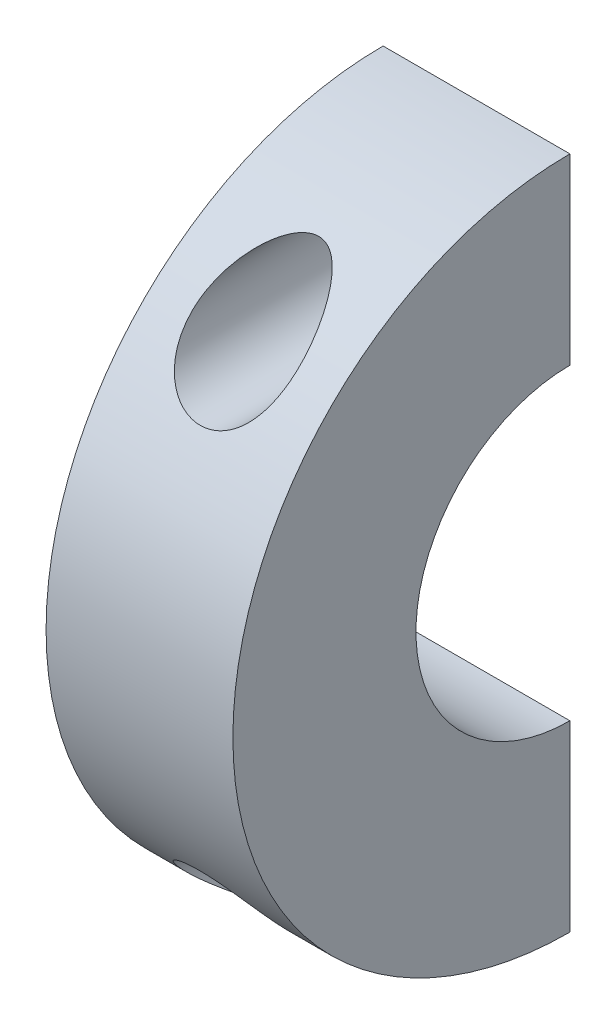
ISO-10303-21;
HEADER;
FILE_DESCRIPTION(('STEP AP214'),'2;1');
FILE_NAME('part.step','',(''),(''),'','','');
FILE_SCHEMA(('AUTOMOTIVE_DESIGN { 1 0 10303 214 1 1 1 1 }'));
ENDSEC;
DATA;
#1=APPLICATION_CONTEXT('core data for automotive mechanical design processes');
#2=APPLICATION_PROTOCOL_DEFINITION('international standard','automotive_design',2000,#1);
#3=PRODUCT_CONTEXT('',#1,'mechanical');
#4=PRODUCT('Part','Part','',(#3));
#5=PRODUCT_RELATED_PRODUCT_CATEGORY('part','',(#4));
#6=PRODUCT_DEFINITION_FORMATION('','',#4);
#7=PRODUCT_DEFINITION_CONTEXT('part definition',#1,'design');
#8=PRODUCT_DEFINITION('design','',#6,#7);
#9=PRODUCT_DEFINITION_SHAPE('','',#8);
#10=(LENGTH_UNIT() NAMED_UNIT(*) SI_UNIT(.MILLI.,.METRE.));
#11=(NAMED_UNIT(*) PLANE_ANGLE_UNIT() SI_UNIT($,.RADIAN.));
#12=(NAMED_UNIT(*) SI_UNIT($,.STERADIAN.) SOLID_ANGLE_UNIT());
#13=UNCERTAINTY_MEASURE_WITH_UNIT(LENGTH_MEASURE(1.E-05),#10,'distance_accuracy_value','');
#14=(GEOMETRIC_REPRESENTATION_CONTEXT(3) GLOBAL_UNCERTAINTY_ASSIGNED_CONTEXT((#13)) GLOBAL_UNIT_ASSIGNED_CONTEXT((#10,
#11,#12)) REPRESENTATION_CONTEXT('',''));
#15=CARTESIAN_POINT('',(0.,0.,0.));
#16=DIRECTION('',(0.,0.,1.));
#17=DIRECTION('',(1.,0.,0.));
#18=AXIS2_PLACEMENT_3D('',#15,#16,#17);
#19=CARTESIAN_POINT('',(46.1249999999998,48.38,-1.2597264670546E-13));
#20=DIRECTION('',(-1.,0.,0.));
#21=DIRECTION('',(0.,-1.,0.));
#22=AXIS2_PLACEMENT_3D('',#19,#20,#21);
#23=PLANE('',#22);
#24=CARTESIAN_POINT('',(46.1249999999998,30.34,0.));
#25=DIRECTION('',(1.,0.,0.));
#26=DIRECTION('',(0.,1.,0.));
#27=AXIS2_PLACEMENT_3D('',#24,#25,#26);
#28=CIRCLE('',#27,8.24);
#29=CARTESIAN_POINT('',(46.1249999999998,38.58,0.));
#30=VERTEX_POINT('',#29);
#31=CARTESIAN_POINT('',(46.1249999999998,22.1,0.));
#32=VERTEX_POINT('',#31);
#33=EDGE_CURVE('E11',#30,#32,#28,.T.);
#34=ORIENTED_EDGE('',*,*,#33,.F.);
#35=DIRECTION('',(0.,-1.,0.));
#36=VECTOR('',#35,1.);
#37=CARTESIAN_POINT('',(46.1249999999998,48.38,-1.2597264670546E-13));
#38=LINE('',#37,#36);
#39=CARTESIAN_POINT('',(46.1249999999998,48.38,-1.2597264670546E-13));
#40=VERTEX_POINT('',#39);
#41=EDGE_CURVE('E114',#40,#30,#38,.T.);
#42=ORIENTED_EDGE('',*,*,#41,.F.);
#43=CARTESIAN_POINT('',(46.1249999999998,30.34,0.));
#44=DIRECTION('',(1.,0.,0.));
#45=DIRECTION('',(0.,1.,0.));
#46=AXIS2_PLACEMENT_3D('',#43,#44,#45);
#47=CIRCLE('',#46,18.04);
#48=CARTESIAN_POINT('',(46.1249999999998,12.3,0.));
#49=VERTEX_POINT('',#48);
#50=EDGE_CURVE('E61',#40,#49,#47,.T.);
#51=ORIENTED_EDGE('',*,*,#50,.T.);
#52=DIRECTION('',(0.,1.,0.));
#53=VECTOR('',#52,1.);
#54=CARTESIAN_POINT('',(46.1249999999998,12.3,0.));
#55=LINE('',#54,#53);
#56=EDGE_CURVE('E96',#49,#32,#55,.T.);
#57=ORIENTED_EDGE('',*,*,#56,.T.);
#58=EDGE_LOOP('',(#34,#42,#51,#57));
#59=FACE_BOUND('',#58,.T.);
#60=ADVANCED_FACE('F45',(#59),#23,.F.);
#61=CARTESIAN_POINT('',(53.2999999999995,30.34,0.));
#62=DIRECTION('',(1.,0.,0.));
#63=DIRECTION('',(0.,1.,0.));
#64=AXIS2_PLACEMENT_3D('',#61,#62,#63);
#65=CYLINDRICAL_SURFACE('',#64,8.24);
#66=CARTESIAN_POINT('',(36.1249999999998,30.34,0.));
#67=DIRECTION('',(1.,0.,0.));
#68=DIRECTION('',(0.,1.,0.));
#69=AXIS2_PLACEMENT_3D('',#66,#67,#68);
#70=CIRCLE('',#69,8.24);
#71=CARTESIAN_POINT('',(36.1249999999998,38.58,0.));
#72=VERTEX_POINT('',#71);
#73=CARTESIAN_POINT('',(36.1249999999998,22.1,0.));
#74=VERTEX_POINT('',#73);
#75=EDGE_CURVE('E54',#72,#74,#70,.T.);
#76=ORIENTED_EDGE('',*,*,#75,.F.);
#77=DIRECTION('',(-1.,0.,0.));
#78=VECTOR('',#77,1.);
#79=CARTESIAN_POINT('',(46.1249999999998,38.58,0.));
#80=LINE('',#79,#78);
#81=EDGE_CURVE('E92',#30,#72,#80,.T.);
#82=ORIENTED_EDGE('',*,*,#81,.F.);
#83=ORIENTED_EDGE('',*,*,#33,.T.);
#84=DIRECTION('',(-1.,0.,0.));
#85=VECTOR('',#84,1.);
#86=CARTESIAN_POINT('',(46.1249999999998,22.1,0.));
#87=LINE('',#86,#85);
#88=EDGE_CURVE('E90',#32,#74,#87,.T.);
#89=ORIENTED_EDGE('',*,*,#88,.T.);
#90=EDGE_LOOP('',(#76,#82,#83,#89));
#91=FACE_BOUND('',#90,.T.);
#92=ADVANCED_FACE('F47',(#91),#65,.F.);
#93=CARTESIAN_POINT('',(36.1249999999998,38.58,0.));
#94=DIRECTION('',(1.,0.,0.));
#95=DIRECTION('',(0.,1.,0.));
#96=AXIS2_PLACEMENT_3D('',#93,#94,#95);
#97=PLANE('',#96);
#98=CARTESIAN_POINT('',(36.1249999999998,30.34,0.));
#99=DIRECTION('',(1.,0.,0.));
#100=DIRECTION('',(0.,1.,0.));
#101=AXIS2_PLACEMENT_3D('',#98,#99,#100);
#102=CIRCLE('',#101,18.04);
#103=CARTESIAN_POINT('',(36.1249999999998,48.38,-1.2597264670546E-13));
#104=VERTEX_POINT('',#103);
#105=CARTESIAN_POINT('',(36.1249999999998,12.3,0.));
#106=VERTEX_POINT('',#105);
#107=EDGE_CURVE('E69',#104,#106,#102,.T.);
#108=ORIENTED_EDGE('',*,*,#107,.F.);
#109=DIRECTION('',(0.,1.,0.));
#110=VECTOR('',#109,1.);
#111=CARTESIAN_POINT('',(36.1249999999998,38.58,0.));
#112=LINE('',#111,#110);
#113=EDGE_CURVE('E119',#72,#104,#112,.T.);
#114=ORIENTED_EDGE('',*,*,#113,.F.);
#115=ORIENTED_EDGE('',*,*,#75,.T.);
#116=DIRECTION('',(0.,-1.,0.));
#117=VECTOR('',#116,1.);
#118=CARTESIAN_POINT('',(36.1249999999998,22.1,0.));
#119=LINE('',#118,#117);
#120=EDGE_CURVE('E104',#74,#106,#119,.T.);
#121=ORIENTED_EDGE('',*,*,#120,.T.);
#122=EDGE_LOOP('',(#108,#114,#115,#121));
#123=FACE_BOUND('',#122,.T.);
#124=ADVANCED_FACE('F130',(#123),#97,.F.);
#125=CARTESIAN_POINT('',(53.2999999999995,30.34,0.));
#126=DIRECTION('',(1.,0.,0.));
#127=DIRECTION('',(0.,1.,0.));
#128=AXIS2_PLACEMENT_3D('',#125,#126,#127);
#129=CYLINDRICAL_SURFACE('',#128,18.04);
#130=CARTESIAN_POINT('',(38.3249999999998,43.48,12.3605016079446));
#131=CARTESIAN_POINT('',(38.3249969211864,43.3180642653231,12.5326448919492));
#132=CARTESIAN_POINT('',(38.3390074796752,43.1526527957382,12.7016788893486));
#133=CARTESIAN_POINT('',(38.3990330359943,42.8182553385481,13.0303316417765));
#134=CARTESIAN_POINT('',(38.4450211069329,42.6492724742552,13.1899581958254));
#135=CARTESIAN_POINT('',(38.5633285267281,42.3394577671585,13.4718737915754));
#136=CARTESIAN_POINT('',(38.6303633843725,42.198381834593,13.5960848567942));
#137=CARTESIAN_POINT('',(38.7928575885274,41.922216046694,13.8320899142004));
#138=CARTESIAN_POINT('',(38.8882847586438,41.7871196129597,13.9438977668117));
#139=CARTESIAN_POINT('',(39.0886794509876,41.5531942380755,14.1323814332384));
#140=CARTESIAN_POINT('',(39.1886646856143,41.45226472368,14.2117367025367));
#141=CARTESIAN_POINT('',(39.4084707803697,41.2631409800474,14.35760517797));
#142=CARTESIAN_POINT('',(39.5282863622152,41.1749433735972,14.4241217912175));
#143=CARTESIAN_POINT('',(39.7219052335326,41.0557124360976,14.5126708785666));
#144=CARTESIAN_POINT('',(39.7891077465505,41.0180013202132,14.5404191604393));
#145=CARTESIAN_POINT('',(39.9276497546312,40.9477337234512,14.5917603608645));
#146=CARTESIAN_POINT('',(39.9989870406613,40.9151745241816,14.6153554715679));
#147=CARTESIAN_POINT('',(40.1452683783646,40.8558140321872,14.6581240228508));
#148=CARTESIAN_POINT('',(40.2202110784153,40.8290106019737,14.677299105067));
#149=CARTESIAN_POINT('',(40.3730296633277,40.7816764742757,14.7110104502913));
#150=CARTESIAN_POINT('',(40.450905026183,40.7611446663315,14.7255475345281));
#151=CARTESIAN_POINT('',(40.6657092513451,40.7144451406598,14.758518066004));
#152=CARTESIAN_POINT('',(40.8048856418667,40.6948183106116,14.7722528703762));
#153=CARTESIAN_POINT('',(41.085160799414,40.6767621078133,14.7848934699463));
#154=CARTESIAN_POINT('',(41.226258513446,40.6783215566821,14.7838070851524));
#155=CARTESIAN_POINT('',(41.4950262670376,40.7015347549663,14.76754405373));
#156=CARTESIAN_POINT('',(41.6228990420298,40.7216453055952,14.7534494672607));
#157=CARTESIAN_POINT('',(41.8728193671726,40.7786673732387,14.7131584137852));
#158=CARTESIAN_POINT('',(41.9948671527632,40.815578210567,14.6869624363621));
#159=CARTESIAN_POINT('',(42.2327122523712,40.9052246276169,14.6226096566597));
#160=CARTESIAN_POINT('',(42.3483246204315,40.9582760772985,14.5842133603111));
#161=CARTESIAN_POINT('',(42.5682368248392,41.077350859046,14.4967700854989));
#162=CARTESIAN_POINT('',(42.6725335023584,41.1433777988938,14.4477201444328));
#163=CARTESIAN_POINT('',(42.8784700620815,41.2929591011275,14.334709918695));
#164=CARTESIAN_POINT('',(42.9787502311544,41.3776149277514,14.2697383549355));
#165=CARTESIAN_POINT('',(43.163204515225,41.5558868051026,14.1300514450606));
#166=CARTESIAN_POINT('',(43.2473680904444,41.6495086597291,14.0553297759976));
#167=CARTESIAN_POINT('',(43.4348859136924,41.8872854658353,13.8612701099816));
#168=CARTESIAN_POINT('',(43.5291581507246,42.0348135743283,13.7372615472776));
#169=CARTESIAN_POINT('',(43.6858200345976,42.3350142308572,13.4759422170798));
#170=CARTESIAN_POINT('',(43.7481475039752,42.4876961996772,13.3386061217816));
#171=CARTESIAN_POINT('',(43.8283623984592,42.7428435198942,13.1007955966174));
#172=CARTESIAN_POINT('',(43.8541169361225,42.845405839517,13.0029501974545));
#173=CARTESIAN_POINT('',(43.8936361686152,43.0493661097724,12.8036705725949));
#174=CARTESIAN_POINT('',(43.9073968492005,43.1507636593698,12.7022351571606));
#175=CARTESIAN_POINT('',(43.9321196585085,43.4521295850535,12.393389707437));
#176=CARTESIAN_POINT('',(43.926483128684,43.6491356200116,12.1815665644799));
#177=CARTESIAN_POINT('',(43.8860494507226,43.9612957164037,11.8294463106611));
#178=CARTESIAN_POINT('',(43.8625335410925,44.0802884573522,11.6909816312714));
#179=CARTESIAN_POINT('',(43.8010502854246,44.3125793493357,11.4123375645441));
#180=CARTESIAN_POINT('',(43.7630773367904,44.4258752733653,11.2721575328584));
#181=CARTESIAN_POINT('',(43.6733758807101,44.6461623746956,10.9912339025993));
#182=CARTESIAN_POINT('',(43.6216443971688,44.7531521818022,10.8504901885918));
#183=CARTESIAN_POINT('',(43.5046619227839,44.9603250161974,10.5696779208588));
#184=CARTESIAN_POINT('',(43.439417151045,45.0605111466181,10.429609086776));
#185=CARTESIAN_POINT('',(43.3204716174631,45.2195366800834,10.2006381047449));
#186=CARTESIAN_POINT('',(43.2708055060732,45.2805047344083,10.1110997688428));
#187=CARTESIAN_POINT('',(43.165356653564,45.399178904615,9.93348507507261));
#188=CARTESIAN_POINT('',(43.1095752016738,45.4568857041582,9.84540841354682));
#189=CARTESIAN_POINT('',(42.9915621948142,45.5686697028596,9.67160127270139));
#190=CARTESIAN_POINT('',(42.9293436849469,45.622753890536,9.58586647671243));
#191=CARTESIAN_POINT('',(42.7977329850531,45.7269998433083,9.41762283244234));
#192=CARTESIAN_POINT('',(42.7283445028726,45.7771636124506,9.33511234688157));
#193=CARTESIAN_POINT('',(42.5730501478771,45.8784827809582,9.16558603158632));
#194=CARTESIAN_POINT('',(42.4861628553977,45.9290960467982,9.07913335301378));
#195=CARTESIAN_POINT('',(42.3006425853336,46.0233600786772,8.91530712036962));
#196=CARTESIAN_POINT('',(42.2020191714227,46.067016446886,8.83792627444715));
#197=CARTESIAN_POINT('',(42.0188388799491,46.1347945796595,8.71605461518679));
#198=CARTESIAN_POINT('',(41.9373124703888,46.1610423877801,8.6682474681253));
#199=CARTESIAN_POINT('',(41.7667915551321,46.2068760320102,8.58406328194377));
#200=CARTESIAN_POINT('',(41.6778123660559,46.2264751327674,8.54766349551411));
#201=CARTESIAN_POINT('',(41.51305563583,46.2539559798859,8.49636836124396));
#202=CARTESIAN_POINT('',(41.4384697258335,46.2634397306476,8.47855218539015));
#203=CARTESIAN_POINT('',(41.2869653399283,46.2763417644053,8.45427755654625));
#204=CARTESIAN_POINT('',(41.2100492789836,46.2797661224168,8.44780772801257));
#205=CARTESIAN_POINT('',(41.0559950754591,46.2802108948397,8.44696854697599));
#206=CARTESIAN_POINT('',(40.9788567797204,46.2772201016018,8.45262037171761));
#207=CARTESIAN_POINT('',(40.8267816005502,46.2651219502651,8.47539070317201));
#208=CARTESIAN_POINT('',(40.7518468827958,46.25600877185,8.49252012115073));
#209=CARTESIAN_POINT('',(40.5841771585545,46.2289464028364,8.54306837100414));
#210=CARTESIAN_POINT('',(40.4927543563617,46.2091781971217,8.57981165999256));
#211=CARTESIAN_POINT('',(40.317670570701,46.1626259228556,8.66536017293365));
#212=CARTESIAN_POINT('',(40.234028321046,46.1358254857836,8.71419352305404));
#213=CARTESIAN_POINT('',(40.0882128446802,46.0819271087619,8.81112150843063));
#214=CARTESIAN_POINT('',(40.0248226962463,46.0556748660229,8.85789571104405));
#215=CARTESIAN_POINT('',(39.9028869730173,46.0001045265421,8.95577509349824));
#216=CARTESIAN_POINT('',(39.8443447668911,45.9707843294807,9.006883235753));
#217=CARTESIAN_POINT('',(39.6751447364737,45.8788479811786,9.16518497794781));
#218=CARTESIAN_POINT('',(39.5711163018189,45.8123352489219,9.27721180237484));
#219=CARTESIAN_POINT('',(39.3861469737661,45.677344166422,9.49857492706166));
#220=CARTESIAN_POINT('',(39.3039942845897,45.6095158173861,9.60732760792185));
#221=CARTESIAN_POINT('',(39.1504565288725,45.4679841970612,9.828680028974));
#222=CARTESIAN_POINT('',(39.0790797669252,45.3942764609353,9.94128265503698));
#223=CARTESIAN_POINT('',(38.9461301564029,45.2414750022846,10.1688977117461));
#224=CARTESIAN_POINT('',(38.8845740754143,45.1623723904583,10.2839138923704));
#225=CARTESIAN_POINT('',(38.7709279747508,44.999281649516,10.5150878881405));
#226=CARTESIAN_POINT('',(38.7188357854389,44.9152946460106,10.6312454351703));
#227=CARTESIAN_POINT('',(38.6158042884018,44.7278979725889,10.8838768425018));
#228=CARTESIAN_POINT('',(38.5665934052717,44.6236268504288,11.0204199767798));
#229=CARTESIAN_POINT('',(38.4811348665241,44.4091415561186,11.2929599485827));
#230=CARTESIAN_POINT('',(38.4448909472386,44.2989256815437,11.4289566175046));
#231=CARTESIAN_POINT('',(38.3860955335763,44.0732685478197,11.6991383957215));
#232=CARTESIAN_POINT('',(38.3635173671366,43.9578379430353,11.8333265307888));
#233=CARTESIAN_POINT('',(38.3329742203263,43.7222622710945,12.0990989295466));
#234=CARTESIAN_POINT('',(38.3250023218037,43.6021194633955,12.230684396742));
#235=CARTESIAN_POINT('',(38.3249999999998,43.48,12.3605016079446));
#236=B_SPLINE_CURVE_WITH_KNOTS('',3,(#130,#131,#132,#133,#134,#135,#136,#137,#138,#139,#140,
#141,#142,#143,#144,#145,#146,#147,#148,#149,#150,#151,#152,#153,#154,#155,#156,#157,#158,#159,
#160,#161,#162,#163,#164,#165,#166,#167,#168,#169,#170,#171,#172,#173,#174,#175,#176,#177,#178,
#179,#180,#181,#182,#183,#184,#185,#186,#187,#188,#189,#190,#191,#192,#193,#194,#195,#196,#197,
#198,#199,#200,#201,#202,#203,#204,#205,#206,#207,#208,#209,#210,#211,#212,#213,#214,#215,#216,
#217,#218,#219,#220,#221,#222,#223,#224,#225,#226,#227,#228,#229,#230,#231,#232,#233,#234,#235),
.UNSPECIFIED.,.T.,.F.,(4,2,2,2,2,2,2,2,2,2,2,2,2,2,2,2,2,2,2,2,2,2,2,2,2,2,2,2,2,2,2,2,2,2,2,2,
2,2,2,2,2,2,2,2,2,2,2,2,2,2,2,2,4),(0.,0.708652240012787,1.41670847586087,2.01330616925526,
2.60923031009984,3.09555672131333,3.58175389362162,3.8271559651084,4.07242811607634,
4.3176090235385,4.5627464938333,4.98392176691197,5.40487482660641,5.79369001644319,
6.18248947744934,6.57944904379214,6.97651913967681,7.41415036060165,7.8520668093099,
8.49218018428319,9.13353479235757,9.56519570777771,9.9970010410895,10.8611728691059,
11.4128664835522,11.9647741161072,12.5168012284952,13.0685748484667,13.4258988311512,
13.7831476275339,14.1396861147349,14.4960411373818,14.8931313760143,15.2899002166887,
15.5832874798604,15.8760859238663,16.1069150987796,16.3375127179669,16.5685135329501,
16.7997342628664,17.0995319891472,17.4000338249166,17.6487968733473,17.8977313530661,
18.3963751941027,18.8525453803406,19.3090653443128,19.7663566049526,20.2235428969896,
20.7591019440161,21.2948151842553,21.8294794487258,22.3638904078456),.UNSPECIFIED.);
#237=CARTESIAN_POINT('',(38.3249999999998,43.48,12.3605016079446));
#238=VERTEX_POINT('',#237);
#239=EDGE_CURVE('E167',#238,#238,#236,.T.);
#240=ORIENTED_EDGE('',*,*,#239,.F.);
#241=EDGE_LOOP('',(#240));
#242=FACE_BOUND('',#241,.T.);
#243=CARTESIAN_POINT('',(38.3249999999998,17.2812635439894,12.4463248460122));
#244=CARTESIAN_POINT('',(38.3250000427971,17.1630995151638,12.3223481034297));
#245=CARTESIAN_POINT('',(38.3324680229311,17.0467300617942,12.1967084950887));
#246=CARTESIAN_POINT('',(38.3611368523309,16.8183207014773,11.9429869759998));
#247=CARTESIAN_POINT('',(38.3823449496766,16.7062831127153,11.8149038108762));
#248=CARTESIAN_POINT('',(38.4377196094537,16.4866449587772,11.5566018659472));
#249=CARTESIAN_POINT('',(38.4719518348348,16.3790699918821,11.4263755177375));
#250=CARTESIAN_POINT('',(38.5527445316473,16.1694556217554,11.1653607779056));
#251=CARTESIAN_POINT('',(38.5993018725925,16.0674148208059,11.0345725372866));
#252=CARTESIAN_POINT('',(38.7058688107913,15.8666770402442,10.7699954022192));
#253=CARTESIAN_POINT('',(38.7661953102258,15.7681348967303,10.6362164292302));
#254=CARTESIAN_POINT('',(38.8998438893132,15.5776697292102,10.3702440471916));
#255=CARTESIAN_POINT('',(38.9731751830473,15.4857514636844,10.2380518337554));
#256=CARTESIAN_POINT('',(39.1331226424315,15.3098494556816,9.97800843218364));
#257=CARTESIAN_POINT('',(39.219647645698,15.2258172135906,9.85013429919047));
#258=CARTESIAN_POINT('',(39.4078911630161,15.0661390874372,9.60065490220618));
#259=CARTESIAN_POINT('',(39.5095819605269,14.9904783343807,9.47903873564616));
#260=CARTESIAN_POINT('',(39.6901744280137,14.8754130582406,9.28954041786871));
#261=CARTESIAN_POINT('',(39.7636551329618,14.8329259756723,9.2183786554497));
#262=CARTESIAN_POINT('',(39.9188990108933,14.7528329034235,9.08229261896779));
#263=CARTESIAN_POINT('',(40.0006702993951,14.7152317802794,9.01737458027434));
#264=CARTESIAN_POINT('',(40.1743549717202,14.6459030730165,8.89617019427294));
#265=CARTESIAN_POINT('',(40.266371750334,14.614246038289,8.83998873892037));
#266=CARTESIAN_POINT('',(40.4600937273873,14.5595109635256,8.74190683805857));
#267=CARTESIAN_POINT('',(40.5617693374608,14.5364077214072,8.69996447067554));
#268=CARTESIAN_POINT('',(40.7412045372228,14.5066826974515,8.64571116247088));
#269=CARTESIAN_POINT('',(40.8169240735674,14.4971913348117,8.6282780539051));
#270=CARTESIAN_POINT('',(40.9706172944794,14.4844637732625,8.6048682372741));
#271=CARTESIAN_POINT('',(41.0485884756932,14.4812208800063,8.59887926849677));
#272=CARTESIAN_POINT('',(41.2046303980733,14.481307131718,8.59903835758277));
#273=CARTESIAN_POINT('',(41.2827011141032,14.4846460948687,8.60520454734732));
#274=CARTESIAN_POINT('',(41.4365527048262,14.497576262328,8.62898509093297));
#275=CARTESIAN_POINT('',(41.5123312307378,14.5071736666781,8.64661079728629));
#276=CARTESIAN_POINT('',(41.6826160286376,14.5356068244802,8.69849795026863));
#277=CARTESIAN_POINT('',(41.775733807041,14.556373706874,8.73620449775083));
#278=CARTESIAN_POINT('',(41.9539764325744,14.6051851497049,8.82381451747495));
#279=CARTESIAN_POINT('',(42.0390821332469,14.633246569218,8.87374622866827));
#280=CARTESIAN_POINT('',(42.1871161992796,14.6895406452982,8.97259014586666));
#281=CARTESIAN_POINT('',(42.2513168633539,14.7168808465057,9.02014648799734));
#282=CARTESIAN_POINT('',(42.3747649719214,14.7747257027496,9.11960306885322));
#283=CARTESIAN_POINT('',(42.43400901726,14.8052324977658,9.17150624052366));
#284=CARTESIAN_POINT('',(42.6051622756038,14.9008691273221,9.33221828364671));
#285=CARTESIAN_POINT('',(42.7102787057436,14.9700293739104,9.44587716813662));
#286=CARTESIAN_POINT('',(42.8954628734034,15.1092895740822,9.66864310208881));
#287=CARTESIAN_POINT('',(42.9769837851105,15.1786058943886,9.77707113318144));
#288=CARTESIAN_POINT('',(43.1291986933711,15.3231507383382,9.99766090676176));
#289=CARTESIAN_POINT('',(43.1998845424193,15.39838364731,10.1098253824962));
#290=CARTESIAN_POINT('',(43.3312965972971,15.5542281991953,10.3364161703135));
#291=CARTESIAN_POINT('',(43.3920115046856,15.6348458002231,10.450844885874));
#292=CARTESIAN_POINT('',(43.5038233842895,15.8009868371701,10.6807682865263));
#293=CARTESIAN_POINT('',(43.5549228328718,15.8865090025436,10.7962626891007));
#294=CARTESIAN_POINT('',(43.6505431134141,16.0676860756259,11.0347843323519));
#295=CARTESIAN_POINT('',(43.6944513589573,16.1636401290685,11.1578302568976));
#296=CARTESIAN_POINT('',(43.7713678138986,16.3604487438147,11.4034433907641));
#297=CARTESIAN_POINT('',(43.8043743190205,16.4613040685129,11.5260105222782));
#298=CARTESIAN_POINT('',(43.8589609713163,16.6674165218383,11.7697702752759));
#299=CARTESIAN_POINT('',(43.8805538251159,16.7726686141049,11.8909642776649));
#300=CARTESIAN_POINT('',(43.9116155087524,16.9871386739083,12.131309227022));
#301=CARTESIAN_POINT('',(43.9210873201955,17.0963556593368,12.2504606693136));
#302=CARTESIAN_POINT('',(43.9287418455998,17.3856395474542,12.557611906709));
#303=CARTESIAN_POINT('',(43.9165700138067,17.5684384263566,12.743460867931));
#304=CARTESIAN_POINT('',(43.853225404411,17.9384713857102,13.1038200526652));
#305=CARTESIAN_POINT('',(43.8021006177022,18.1256997341424,13.2783439420207));
#306=CARTESIAN_POINT('',(43.6723825344593,18.4535077653001,13.5716384730811));
#307=CARTESIAN_POINT('',(43.6031134511155,18.5946733520648,13.6938495898943));
#308=CARTESIAN_POINT('',(43.435960037869,18.8704000942707,13.9255925759106));
#309=CARTESIAN_POINT('',(43.3381146549745,19.0049699495055,14.0351414209043));
#310=CARTESIAN_POINT('',(43.1340920544845,19.2364174405315,14.2186366759802));
#311=CARTESIAN_POINT('',(43.0330513904625,19.3355923152077,14.2953899958598));
#312=CARTESIAN_POINT('',(42.811626439582,19.5209179281576,14.4361552959069));
#313=CARTESIAN_POINT('',(42.6912469294432,19.6070718724452,14.5001704137082));
#314=CARTESIAN_POINT('',(42.4972821466132,19.7231100627988,14.5851156255448));
#315=CARTESIAN_POINT('',(42.430064754028,19.7597238812123,14.611677673139));
#316=CARTESIAN_POINT('',(42.2916661816962,19.8277953652677,14.6607266639117));
#317=CARTESIAN_POINT('',(42.2204870744236,19.8592556934907,14.6832157120678));
#318=CARTESIAN_POINT('',(42.0746959122785,19.9164495568749,14.7238729064317));
#319=CARTESIAN_POINT('',(42.0000849774909,19.9421849447686,14.7420424506693));
#320=CARTESIAN_POINT('',(41.8480994369282,19.9874462575241,14.7738616480389));
#321=CARTESIAN_POINT('',(41.7707252844896,20.0069731957924,14.7875120388483));
#322=CARTESIAN_POINT('',(41.5564346622027,20.0512892737442,14.8184097189385));
#323=CARTESIAN_POINT('',(41.417374591225,20.0694749636495,14.8309810850477));
#324=CARTESIAN_POINT('',(41.137663557396,20.0847380696697,14.8415393596334));
#325=CARTESIAN_POINT('',(40.9970134128375,20.0818258899964,14.8395334567486));
#326=CARTESIAN_POINT('',(40.7285975997532,20.0561037207945,14.8217165028476));
#327=CARTESIAN_POINT('',(40.6006259874889,20.0347206878346,14.8068954042946));
#328=CARTESIAN_POINT('',(40.3507291732351,19.9751471808799,14.765254293228));
#329=CARTESIAN_POINT('',(40.2288038432287,19.9369570629077,14.7384345348805));
#330=CARTESIAN_POINT('',(39.9911113244947,19.8446470046208,14.672846431668));
#331=CARTESIAN_POINT('',(39.8755552548916,19.7901749113586,14.6338129435651));
#332=CARTESIAN_POINT('',(39.6559799611707,19.6682636575965,14.5451474637003));
#333=CARTESIAN_POINT('',(39.5519637555431,19.6008211169586,14.4955127088424));
#334=CARTESIAN_POINT('',(39.3467676942783,19.4482585995277,14.3812905562401));
#335=CARTESIAN_POINT('',(39.2469770479856,19.3620343554577,14.3156908717065));
#336=CARTESIAN_POINT('',(39.0637220016361,19.1806821844242,14.1747826427223));
#337=CARTESIAN_POINT('',(38.9802696616113,19.0855477564607,14.0994669940036));
#338=CARTESIAN_POINT('',(38.7949387689671,18.8443897762522,13.904180705893));
#339=CARTESIAN_POINT('',(38.702199388275,18.6950605189498,13.779587309011));
#340=CARTESIAN_POINT('',(38.5489005446488,18.3915502496866,13.517269379609));
#341=CARTESIAN_POINT('',(38.4883922165625,18.2373619367733,13.3795243877629));
#342=CARTESIAN_POINT('',(38.4018040478069,17.9477774245847,13.1113948478873));
#343=CARTESIAN_POINT('',(38.372488725224,17.8123242788781,12.9820791231614));
#344=CARTESIAN_POINT('',(38.3340963250525,17.5442750374551,12.7179554653028));
#345=CARTESIAN_POINT('',(38.3249999527661,17.4116763375765,12.5831528934366));
#346=CARTESIAN_POINT('',(38.3249999999998,17.2812635439894,12.4463248460122));
#347=B_SPLINE_CURVE_WITH_KNOTS('',3,(#243,#244,#245,#246,#247,#248,#249,#250,#251,#252,#253,
#254,#255,#256,#257,#258,#259,#260,#261,#262,#263,#264,#265,#266,#267,#268,#269,#270,#271,#272,
#273,#274,#275,#276,#277,#278,#279,#280,#281,#282,#283,#284,#285,#286,#287,#288,#289,#290,#291,
#292,#293,#294,#295,#296,#297,#298,#299,#300,#301,#302,#303,#304,#305,#306,#307,#308,#309,#310,
#311,#312,#313,#314,#315,#316,#317,#318,#319,#320,#321,#322,#323,#324,#325,#326,#327,#328,#329,
#330,#331,#332,#333,#334,#335,#336,#337,#338,#339,#340,#341,#342,#343,#344,#345,#346),
.UNSPECIFIED.,.T.,.F.,(4,2,2,2,2,2,2,2,2,2,2,2,2,2,2,2,2,2,2,2,2,2,2,2,2,2,2,2,2,2,2,2,2,2,2,2,
2,2,2,2,2,2,2,2,2,2,2,2,2,2,2,4),(0.,0.513597386017503,1.02746592177651,1.54396028466168,
2.06032358753847,2.59004759992171,3.12014843975944,3.64673990674331,4.17238052452186,
4.50422247304939,4.83639245138816,5.17228516039564,5.5071801995278,5.74103106453127,
5.97463125196192,6.20858016547276,6.44276119765846,6.74880092976478,7.05555436637179,
7.30853062945178,7.56167898056861,8.06879594846896,8.52526785727869,8.98208134722445,
9.43940895010974,9.89661861107988,10.3824678643829,10.8683930349093,11.3537760876535,
11.8390397200149,12.6191177783487,13.398236314378,13.9935704808682,14.5880970152859,
15.0693857246468,15.5505557373475,15.7933138578956,16.0359461577282,16.2784998211358,
16.5210138721097,16.9409689511154,17.3607169474088,17.7506725122734,18.1406198171478,
18.5397003400789,18.9388850058823,19.3790795775975,19.819597861519,20.4624274212429,
21.1062738208683,21.6736518718453,22.2404882479853),.UNSPECIFIED.);
#348=CARTESIAN_POINT('',(38.3249999999998,17.2812635439894,12.4463248460122));
#349=VERTEX_POINT('',#348);
#350=EDGE_CURVE('E160',#349,#349,#347,.T.);
#351=ORIENTED_EDGE('',*,*,#350,.F.);
#352=EDGE_LOOP('',(#351));
#353=FACE_BOUND('',#352,.T.);
#354=DIRECTION('',(1.,0.,0.));
#355=VECTOR('',#354,1.);
#356=CARTESIAN_POINT('',(36.1249999999998,48.38,-1.2597264670546E-13));
#357=LINE('',#356,#355);
#358=EDGE_CURVE('E122',#104,#40,#357,.T.);
#359=ORIENTED_EDGE('',*,*,#358,.F.);
#360=ORIENTED_EDGE('',*,*,#107,.T.);
#361=DIRECTION('',(1.,0.,0.));
#362=VECTOR('',#361,1.);
#363=CARTESIAN_POINT('',(36.1249999999998,12.3,0.));
#364=LINE('',#363,#362);
#365=EDGE_CURVE('E108',#106,#49,#364,.T.);
#366=ORIENTED_EDGE('',*,*,#365,.T.);
#367=ORIENTED_EDGE('',*,*,#50,.F.);
#368=EDGE_LOOP('',(#359,#360,#366,#367));
#369=FACE_BOUND('',#368,.T.);
#370=ADVANCED_FACE('F133',(#242,#353,#369),#129,.T.);
#371=CARTESIAN_POINT('',(0.,60.6799999999999,-2.11863087641001E-13));
#372=DIRECTION('',(0.,0.,-1.));
#373=DIRECTION('',(1.,0.,0.));
#374=AXIS2_PLACEMENT_3D('',#371,#372,#373);
#375=PLANE('',#374);
#376=CARTESIAN_POINT('',(41.1249999999998,43.48,0.));
#377=DIRECTION('',(0.,0.,-1.));
#378=DIRECTION('',(-1.,0.,0.));
#379=AXIS2_PLACEMENT_3D('',#376,#377,#378);
#380=CIRCLE('',#379,2.8);
#381=CARTESIAN_POINT('',(38.3249999999998,43.48,0.));
#382=VERTEX_POINT('',#381);
#383=EDGE_CURVE('E100',#382,#382,#380,.T.);
#384=ORIENTED_EDGE('',*,*,#383,.F.);
#385=EDGE_LOOP('',(#384));
#386=FACE_BOUND('',#385,.T.);
#387=ORIENTED_EDGE('',*,*,#41,.T.);
#388=ORIENTED_EDGE('',*,*,#81,.T.);
#389=ORIENTED_EDGE('',*,*,#113,.T.);
#390=ORIENTED_EDGE('',*,*,#358,.T.);
#391=EDGE_LOOP('',(#387,#388,#389,#390));
#392=FACE_BOUND('',#391,.T.);
#393=ADVANCED_FACE('F132',(#386,#392),#375,.T.);
#394=CARTESIAN_POINT('',(0.,0.,0.));
#395=DIRECTION('',(0.,0.,1.));
#396=DIRECTION('',(1.,0.,0.));
#397=AXIS2_PLACEMENT_3D('',#394,#395,#396);
#398=PLANE('',#397);
#399=CARTESIAN_POINT('',(41.1249999999998,17.2812635439894,0.));
#400=DIRECTION('',(0.,0.,-1.));
#401=DIRECTION('',(1.,0.,0.));
#402=AXIS2_PLACEMENT_3D('',#399,#400,#401);
#403=CIRCLE('',#402,2.8);
#404=CARTESIAN_POINT('',(43.9249999999998,17.2812635439894,0.));
#405=VERTEX_POINT('',#404);
#406=EDGE_CURVE('E168',#405,#405,#403,.T.);
#407=ORIENTED_EDGE('',*,*,#406,.F.);
#408=EDGE_LOOP('',(#407));
#409=FACE_BOUND('',#408,.T.);
#410=ORIENTED_EDGE('',*,*,#56,.F.);
#411=ORIENTED_EDGE('',*,*,#365,.F.);
#412=ORIENTED_EDGE('',*,*,#120,.F.);
#413=ORIENTED_EDGE('',*,*,#88,.F.);
#414=EDGE_LOOP('',(#410,#411,#412,#413));
#415=FACE_BOUND('',#414,.T.);
#416=ADVANCED_FACE('F103',(#409,#415),#398,.F.);
#417=CARTESIAN_POINT('',(41.1249999999998,17.2812635439894,18.042));
#418=DIRECTION('',(0.,0.,-1.));
#419=DIRECTION('',(-1.,0.,0.));
#420=AXIS2_PLACEMENT_3D('',#417,#418,#419);
#421=CYLINDRICAL_SURFACE('',#420,2.8);
#422=ORIENTED_EDGE('',*,*,#350,.T.);
#423=EDGE_LOOP('',(#422));
#424=FACE_BOUND('',#423,.T.);
#425=ORIENTED_EDGE('',*,*,#406,.T.);
#426=EDGE_LOOP('',(#425));
#427=FACE_BOUND('',#426,.T.);
#428=ADVANCED_FACE('F153',(#424,#427),#421,.F.);
#429=CARTESIAN_POINT('',(41.1249999999998,43.48,18.042));
#430=DIRECTION('',(0.,0.,-1.));
#431=DIRECTION('',(-1.,0.,0.));
#432=AXIS2_PLACEMENT_3D('',#429,#430,#431);
#433=CYLINDRICAL_SURFACE('',#432,2.8);
#434=ORIENTED_EDGE('',*,*,#239,.T.);
#435=EDGE_LOOP('',(#434));
#436=FACE_BOUND('',#435,.T.);
#437=ORIENTED_EDGE('',*,*,#383,.T.);
#438=EDGE_LOOP('',(#437));
#439=FACE_BOUND('',#438,.T.);
#440=ADVANCED_FACE('F179',(#436,#439),#433,.F.);
#441=CLOSED_SHELL('',(#60,#92,#124,#370,#393,#416,#428,#440));
#442=MANIFOLD_SOLID_BREP('B2',#441);
#443=ADVANCED_BREP_SHAPE_REPRESENTATION('',(#18,#442),#14);
#444=SHAPE_DEFINITION_REPRESENTATION(#9,#443);
ENDSEC;
END-ISO-10303-21;
